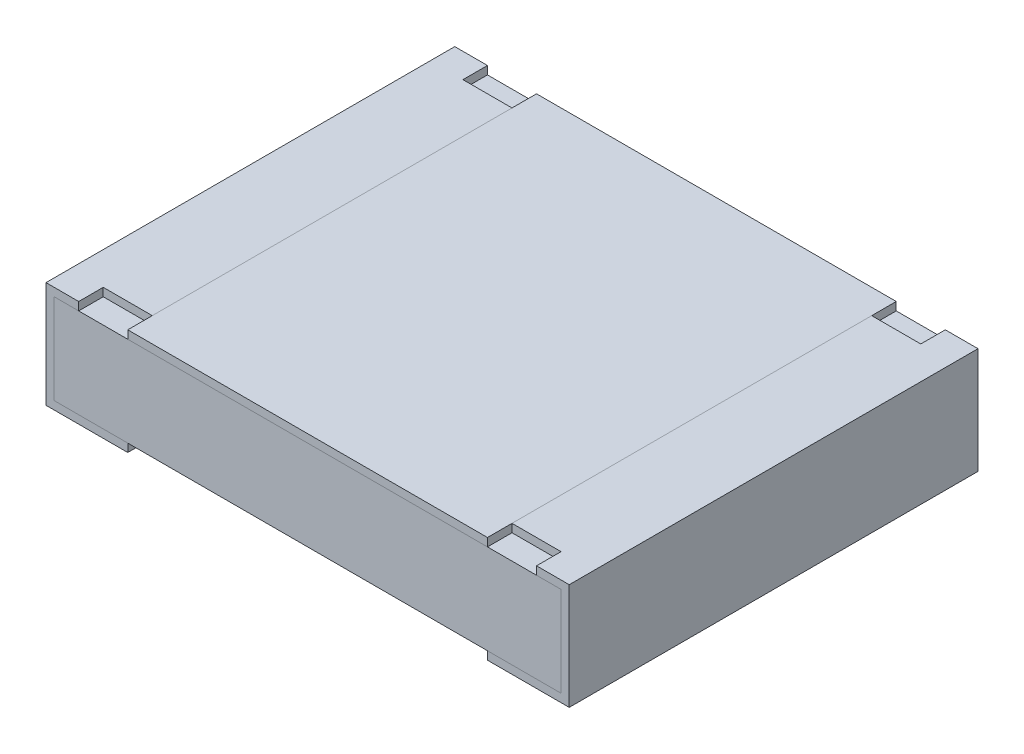
ISO-10303-21;
HEADER;
FILE_DESCRIPTION(('STEP AP214'),'2;1');
FILE_NAME('part.step','',(''),(''),'','','');
FILE_SCHEMA(('AUTOMOTIVE_DESIGN { 1 0 10303 214 1 1 1 1 }'));
ENDSEC;
DATA;
#1=APPLICATION_CONTEXT('core data for automotive mechanical design processes');
#2=APPLICATION_PROTOCOL_DEFINITION('international standard','automotive_design',2000,#1);
#3=PRODUCT_CONTEXT('',#1,'mechanical');
#4=PRODUCT('Part','Part','',(#3));
#5=PRODUCT_RELATED_PRODUCT_CATEGORY('part','',(#4));
#6=PRODUCT_DEFINITION_FORMATION('','',#4);
#7=PRODUCT_DEFINITION_CONTEXT('part definition',#1,'design');
#8=PRODUCT_DEFINITION('design','',#6,#7);
#9=PRODUCT_DEFINITION_SHAPE('','',#8);
#10=(LENGTH_UNIT() NAMED_UNIT(*) SI_UNIT(.MILLI.,.METRE.));
#11=(NAMED_UNIT(*) PLANE_ANGLE_UNIT() SI_UNIT($,.RADIAN.));
#12=(NAMED_UNIT(*) SI_UNIT($,.STERADIAN.) SOLID_ANGLE_UNIT());
#13=UNCERTAINTY_MEASURE_WITH_UNIT(LENGTH_MEASURE(1.E-05),#10,'distance_accuracy_value','');
#14=(GEOMETRIC_REPRESENTATION_CONTEXT(3) GLOBAL_UNCERTAINTY_ASSIGNED_CONTEXT((#13)) GLOBAL_UNIT_ASSIGNED_CONTEXT((#10,
#11,#12)) REPRESENTATION_CONTEXT('',''));
#15=CARTESIAN_POINT('',(0.,0.,0.));
#16=DIRECTION('',(0.,0.,1.));
#17=DIRECTION('',(1.,0.,0.));
#18=AXIS2_PLACEMENT_3D('',#15,#16,#17);
#19=CARTESIAN_POINT('',(-1.55,0.05,-1.25));
#20=DIRECTION('',(0.,1.,0.));
#21=DIRECTION('',(0.,0.,1.));
#22=AXIS2_PLACEMENT_3D('',#19,#20,#21);
#23=PLANE('',#22);
#24=DIRECTION('',(0.,0.,-1.));
#25=VECTOR('',#24,1.);
#26=CARTESIAN_POINT('',(-1.55,0.05,-1.25));
#27=LINE('',#26,#25);
#28=CARTESIAN_POINT('',(-1.55,0.05,1.25));
#29=VERTEX_POINT('',#28);
#30=CARTESIAN_POINT('',(-1.55,0.05,-1.25));
#31=VERTEX_POINT('',#30);
#32=EDGE_CURVE('P0_E58',#29,#31,#27,.T.);
#33=ORIENTED_EDGE('',*,*,#32,.T.);
#34=DIRECTION('',(1.,0.,0.));
#35=VECTOR('',#34,1.);
#36=CARTESIAN_POINT('',(1.55,0.05,-1.25));
#37=LINE('',#36,#35);
#38=CARTESIAN_POINT('',(1.55,0.05,-1.25));
#39=VERTEX_POINT('',#38);
#40=EDGE_CURVE('P0_E20',#31,#39,#37,.T.);
#41=ORIENTED_EDGE('',*,*,#40,.T.);
#42=DIRECTION('',(0.,0.,1.));
#43=VECTOR('',#42,1.);
#44=CARTESIAN_POINT('',(1.55,0.05,-1.25));
#45=LINE('',#44,#43);
#46=CARTESIAN_POINT('',(1.55,0.05,1.25));
#47=VERTEX_POINT('',#46);
#48=EDGE_CURVE('P0_E55',#39,#47,#45,.T.);
#49=ORIENTED_EDGE('',*,*,#48,.T.);
#50=DIRECTION('',(-1.,0.,0.));
#51=VECTOR('',#50,1.);
#52=CARTESIAN_POINT('',(1.55,0.05,1.25));
#53=LINE('',#52,#51);
#54=EDGE_CURVE('P0_E76',#47,#29,#53,.T.);
#55=ORIENTED_EDGE('',*,*,#54,.T.);
#56=EDGE_LOOP('',(#33,#41,#49,#55));
#57=FACE_BOUND('',#56,.T.);
#58=ADVANCED_FACE('P0_F17',(#57),#23,.F.);
#59=CARTESIAN_POINT('',(1.55,0.6,-1.25));
#60=DIRECTION('',(0.,0.,1.));
#61=DIRECTION('',(1.,0.,0.));
#62=AXIS2_PLACEMENT_3D('',#59,#60,#61);
#63=PLANE('',#62);
#64=ORIENTED_EDGE('',*,*,#40,.F.);
#65=DIRECTION('',(0.,1.,0.));
#66=VECTOR('',#65,1.);
#67=CARTESIAN_POINT('',(-1.55,0.6,-1.25));
#68=LINE('',#67,#66);
#69=CARTESIAN_POINT('',(-1.55,0.6,-1.25));
#70=VERTEX_POINT('',#69);
#71=EDGE_CURVE('P0_E80',#31,#70,#68,.T.);
#72=ORIENTED_EDGE('',*,*,#71,.T.);
#73=DIRECTION('',(1.,0.,0.));
#74=VECTOR('',#73,1.);
#75=CARTESIAN_POINT('',(-1.55,0.6,-1.25));
#76=LINE('',#75,#74);
#77=CARTESIAN_POINT('',(1.55,0.6,-1.25));
#78=VERTEX_POINT('',#77);
#79=EDGE_CURVE('P0_E73',#70,#78,#76,.T.);
#80=ORIENTED_EDGE('',*,*,#79,.T.);
#81=DIRECTION('',(0.,1.,0.));
#82=VECTOR('',#81,1.);
#83=CARTESIAN_POINT('',(1.55,0.6,-1.25));
#84=LINE('',#83,#82);
#85=EDGE_CURVE('P0_E63',#78,#39,#84,.F.);
#86=ORIENTED_EDGE('',*,*,#85,.T.);
#87=EDGE_LOOP('',(#64,#72,#80,#86));
#88=FACE_BOUND('',#87,.T.);
#89=ADVANCED_FACE('P0_F72',(#88),#63,.F.);
#90=CARTESIAN_POINT('',(1.55,0.6,-1.25));
#91=DIRECTION('',(-1.,0.,0.));
#92=DIRECTION('',(0.,0.,1.));
#93=AXIS2_PLACEMENT_3D('',#90,#91,#92);
#94=PLANE('',#93);
#95=ORIENTED_EDGE('',*,*,#48,.F.);
#96=ORIENTED_EDGE('',*,*,#85,.F.);
#97=DIRECTION('',(0.,0.,-1.));
#98=VECTOR('',#97,1.);
#99=CARTESIAN_POINT('',(1.55,0.6,1.25));
#100=LINE('',#99,#98);
#101=CARTESIAN_POINT('',(1.55,0.6,1.25));
#102=VERTEX_POINT('',#101);
#103=EDGE_CURVE('P0_E83',#78,#102,#100,.F.);
#104=ORIENTED_EDGE('',*,*,#103,.T.);
#105=DIRECTION('',(0.,1.,0.));
#106=VECTOR('',#105,1.);
#107=CARTESIAN_POINT('',(1.55,0.6,1.25));
#108=LINE('',#107,#106);
#109=EDGE_CURVE('P0_E69',#102,#47,#108,.F.);
#110=ORIENTED_EDGE('',*,*,#109,.T.);
#111=EDGE_LOOP('',(#95,#96,#104,#110));
#112=FACE_BOUND('',#111,.T.);
#113=ADVANCED_FACE('P0_F66',(#112),#94,.F.);
#114=CARTESIAN_POINT('',(1.55,0.6,1.25));
#115=DIRECTION('',(0.,0.,-1.));
#116=DIRECTION('',(-1.,0.,0.));
#117=AXIS2_PLACEMENT_3D('',#114,#115,#116);
#118=PLANE('',#117);
#119=ORIENTED_EDGE('',*,*,#54,.F.);
#120=ORIENTED_EDGE('',*,*,#109,.F.);
#121=DIRECTION('',(1.,0.,0.));
#122=VECTOR('',#121,1.);
#123=CARTESIAN_POINT('',(-1.55,0.6,1.25));
#124=LINE('',#123,#122);
#125=CARTESIAN_POINT('',(-1.55,0.6,1.25));
#126=VERTEX_POINT('',#125);
#127=EDGE_CURVE('P0_E26',#102,#126,#124,.F.);
#128=ORIENTED_EDGE('',*,*,#127,.T.);
#129=DIRECTION('',(0.,1.,0.));
#130=VECTOR('',#129,1.);
#131=CARTESIAN_POINT('',(-1.55,0.6,1.25));
#132=LINE('',#131,#130);
#133=EDGE_CURVE('P0_E34',#126,#29,#132,.F.);
#134=ORIENTED_EDGE('',*,*,#133,.T.);
#135=EDGE_LOOP('',(#119,#120,#128,#134));
#136=FACE_BOUND('',#135,.T.);
#137=ADVANCED_FACE('P0_F88',(#136),#118,.F.);
#138=CARTESIAN_POINT('',(-1.55,0.6,-1.25));
#139=DIRECTION('',(1.,0.,0.));
#140=DIRECTION('',(0.,0.,-1.));
#141=AXIS2_PLACEMENT_3D('',#138,#139,#140);
#142=PLANE('',#141);
#143=ORIENTED_EDGE('',*,*,#32,.F.);
#144=ORIENTED_EDGE('',*,*,#133,.F.);
#145=DIRECTION('',(0.,0.,-1.));
#146=VECTOR('',#145,1.);
#147=CARTESIAN_POINT('',(-1.55,0.6,1.25));
#148=LINE('',#147,#146);
#149=EDGE_CURVE('P0_E11',#126,#70,#148,.T.);
#150=ORIENTED_EDGE('',*,*,#149,.T.);
#151=ORIENTED_EDGE('',*,*,#71,.F.);
#152=EDGE_LOOP('',(#143,#144,#150,#151));
#153=FACE_BOUND('',#152,.T.);
#154=ADVANCED_FACE('P0_F91',(#153),#142,.F.);
#155=CARTESIAN_POINT('',(-1.55,0.6,1.25));
#156=DIRECTION('',(0.,-1.,0.));
#157=DIRECTION('',(0.,0.,-1.));
#158=AXIS2_PLACEMENT_3D('',#155,#156,#157);
#159=PLANE('',#158);
#160=ORIENTED_EDGE('',*,*,#127,.F.);
#161=ORIENTED_EDGE('',*,*,#103,.F.);
#162=ORIENTED_EDGE('',*,*,#79,.F.);
#163=ORIENTED_EDGE('',*,*,#149,.F.);
#164=EDGE_LOOP('',(#160,#161,#162,#163));
#165=FACE_BOUND('',#164,.T.);
#166=ADVANCED_FACE('P0_F90',(#165),#159,.F.);
#167=CLOSED_SHELL('',(#58,#89,#113,#137,#154,#166));
#168=MANIFOLD_SOLID_BREP('P0_B1',#167);
#169=CARTESIAN_POINT('',(3.60049995001,0.65,1.25));
#170=DIRECTION('',(0.,-1.,0.));
#171=DIRECTION('',(1.,0.,0.));
#172=AXIS2_PLACEMENT_3D('',#169,#170,#171);
#173=PLANE('',#172);
#174=DIRECTION('',(1.,0.,0.));
#175=VECTOR('',#174,1.);
#176=CARTESIAN_POINT('',(3.60049995001,0.65,-1.25));
#177=LINE('',#176,#175);
#178=CARTESIAN_POINT('',(1.1,0.65,-1.25));
#179=VERTEX_POINT('',#178);
#180=CARTESIAN_POINT('',(-1.1,0.65,-1.25));
#181=VERTEX_POINT('',#180);
#182=EDGE_CURVE('P1_E20',#179,#181,#177,.F.);
#183=ORIENTED_EDGE('',*,*,#182,.T.);
#184=DIRECTION('',(0.,0.,-1.));
#185=VECTOR('',#184,1.);
#186=CARTESIAN_POINT('',(-1.1,0.65,1.25));
#187=LINE('',#186,#185);
#188=CARTESIAN_POINT('',(-1.1,0.65,1.25));
#189=VERTEX_POINT('',#188);
#190=EDGE_CURVE('P1_E55',#181,#189,#187,.F.);
#191=ORIENTED_EDGE('',*,*,#190,.T.);
#192=DIRECTION('',(-1.,0.,0.));
#193=VECTOR('',#192,1.);
#194=CARTESIAN_POINT('',(3.60049995001,0.65,1.25));
#195=LINE('',#194,#193);
#196=CARTESIAN_POINT('',(1.1,0.65,1.25));
#197=VERTEX_POINT('',#196);
#198=EDGE_CURVE('P1_E76',#189,#197,#195,.F.);
#199=ORIENTED_EDGE('',*,*,#198,.T.);
#200=DIRECTION('',(0.,0.,-1.));
#201=VECTOR('',#200,1.);
#202=CARTESIAN_POINT('',(1.1,0.65,1.25));
#203=LINE('',#202,#201);
#204=EDGE_CURVE('P1_E58',#179,#197,#203,.F.);
#205=ORIENTED_EDGE('',*,*,#204,.F.);
#206=EDGE_LOOP('',(#183,#191,#199,#205));
#207=FACE_BOUND('',#206,.T.);
#208=ADVANCED_FACE('P1_F17',(#207),#173,.F.);
#209=CARTESIAN_POINT('',(3.60049995001,0.65,-1.25));
#210=DIRECTION('',(0.,0.,1.));
#211=DIRECTION('',(1.,0.,0.));
#212=AXIS2_PLACEMENT_3D('',#209,#210,#211);
#213=PLANE('',#212);
#214=DIRECTION('',(-1.,0.,0.));
#215=VECTOR('',#214,1.);
#216=CARTESIAN_POINT('',(3.60049995001,0.6,-1.25));
#217=LINE('',#216,#215);
#218=CARTESIAN_POINT('',(1.1,0.6,-1.25));
#219=VERTEX_POINT('',#218);
#220=CARTESIAN_POINT('',(-1.1,0.6,-1.25));
#221=VERTEX_POINT('',#220);
#222=EDGE_CURVE('P1_E73',#219,#221,#217,.T.);
#223=ORIENTED_EDGE('',*,*,#222,.T.);
#224=DIRECTION('',(0.,1.,0.));
#225=VECTOR('',#224,1.);
#226=CARTESIAN_POINT('',(-1.1,0.6,-1.25));
#227=LINE('',#226,#225);
#228=EDGE_CURVE('P1_E63',#221,#181,#227,.T.);
#229=ORIENTED_EDGE('',*,*,#228,.T.);
#230=ORIENTED_EDGE('',*,*,#182,.F.);
#231=DIRECTION('',(0.,1.,0.));
#232=VECTOR('',#231,1.);
#233=CARTESIAN_POINT('',(1.1,0.65,-1.25));
#234=LINE('',#233,#232);
#235=EDGE_CURVE('P1_E80',#219,#179,#234,.T.);
#236=ORIENTED_EDGE('',*,*,#235,.F.);
#237=EDGE_LOOP('',(#223,#229,#230,#236));
#238=FACE_BOUND('',#237,.T.);
#239=ADVANCED_FACE('P1_F72',(#238),#213,.F.);
#240=CARTESIAN_POINT('',(-1.1,0.6,1.25));
#241=DIRECTION('',(1.,0.,0.));
#242=DIRECTION('',(0.,0.,-1.));
#243=AXIS2_PLACEMENT_3D('',#240,#241,#242);
#244=PLANE('',#243);
#245=ORIENTED_EDGE('',*,*,#190,.F.);
#246=ORIENTED_EDGE('',*,*,#228,.F.);
#247=DIRECTION('',(0.,0.,1.));
#248=VECTOR('',#247,1.);
#249=CARTESIAN_POINT('',(-1.1,0.6,1.25));
#250=LINE('',#249,#248);
#251=CARTESIAN_POINT('',(-1.1,0.6,1.25));
#252=VERTEX_POINT('',#251);
#253=EDGE_CURVE('P1_E83',#221,#252,#250,.T.);
#254=ORIENTED_EDGE('',*,*,#253,.T.);
#255=DIRECTION('',(0.,1.,0.));
#256=VECTOR('',#255,1.);
#257=CARTESIAN_POINT('',(-1.1,0.65,1.25));
#258=LINE('',#257,#256);
#259=EDGE_CURVE('P1_E69',#252,#189,#258,.T.);
#260=ORIENTED_EDGE('',*,*,#259,.T.);
#261=EDGE_LOOP('',(#245,#246,#254,#260));
#262=FACE_BOUND('',#261,.T.);
#263=ADVANCED_FACE('P1_F66',(#262),#244,.F.);
#264=CARTESIAN_POINT('',(3.60049995001,0.65,1.25));
#265=DIRECTION('',(0.,0.,-1.));
#266=DIRECTION('',(-1.,0.,0.));
#267=AXIS2_PLACEMENT_3D('',#264,#265,#266);
#268=PLANE('',#267);
#269=ORIENTED_EDGE('',*,*,#198,.F.);
#270=ORIENTED_EDGE('',*,*,#259,.F.);
#271=DIRECTION('',(-1.,0.,0.));
#272=VECTOR('',#271,1.);
#273=CARTESIAN_POINT('',(3.60049995001,0.6,1.25));
#274=LINE('',#273,#272);
#275=CARTESIAN_POINT('',(1.1,0.6,1.25));
#276=VERTEX_POINT('',#275);
#277=EDGE_CURVE('P1_E26',#252,#276,#274,.F.);
#278=ORIENTED_EDGE('',*,*,#277,.T.);
#279=DIRECTION('',(0.,1.,0.));
#280=VECTOR('',#279,1.);
#281=CARTESIAN_POINT('',(1.1,0.65,1.25));
#282=LINE('',#281,#280);
#283=EDGE_CURVE('P1_E34',#197,#276,#282,.F.);
#284=ORIENTED_EDGE('',*,*,#283,.F.);
#285=EDGE_LOOP('',(#269,#270,#278,#284));
#286=FACE_BOUND('',#285,.T.);
#287=ADVANCED_FACE('P1_F88',(#286),#268,.F.);
#288=CARTESIAN_POINT('',(1.1,0.65,1.25));
#289=DIRECTION('',(1.,0.,0.));
#290=DIRECTION('',(0.,0.,-1.));
#291=AXIS2_PLACEMENT_3D('',#288,#289,#290);
#292=PLANE('',#291);
#293=DIRECTION('',(0.,0.,1.));
#294=VECTOR('',#293,1.);
#295=CARTESIAN_POINT('',(1.1,0.6,1.25));
#296=LINE('',#295,#294);
#297=EDGE_CURVE('P1_E11',#276,#219,#296,.F.);
#298=ORIENTED_EDGE('',*,*,#297,.T.);
#299=ORIENTED_EDGE('',*,*,#235,.T.);
#300=ORIENTED_EDGE('',*,*,#204,.T.);
#301=ORIENTED_EDGE('',*,*,#283,.T.);
#302=EDGE_LOOP('',(#298,#299,#300,#301));
#303=FACE_BOUND('',#302,.T.);
#304=ADVANCED_FACE('P1_F91',(#303),#292,.T.);
#305=CARTESIAN_POINT('',(3.60049995001,0.6,1.25));
#306=DIRECTION('',(0.,1.,0.));
#307=DIRECTION('',(-1.,0.,0.));
#308=AXIS2_PLACEMENT_3D('',#305,#306,#307);
#309=PLANE('',#308);
#310=ORIENTED_EDGE('',*,*,#277,.F.);
#311=ORIENTED_EDGE('',*,*,#253,.F.);
#312=ORIENTED_EDGE('',*,*,#222,.F.);
#313=ORIENTED_EDGE('',*,*,#297,.F.);
#314=EDGE_LOOP('',(#310,#311,#312,#313));
#315=FACE_BOUND('',#314,.T.);
#316=ADVANCED_FACE('P1_F90',(#315),#309,.F.);
#317=CLOSED_SHELL('',(#208,#239,#263,#287,#304,#316));
#318=MANIFOLD_SOLID_BREP('P1_B1',#317);
#319=CARTESIAN_POINT('',(-1.55,0.6,-1.25));
#320=DIRECTION('',(1.,0.,0.));
#321=DIRECTION('',(0.,0.,-1.));
#322=AXIS2_PLACEMENT_3D('',#319,#320,#321);
#323=PLANE('',#322);
#324=DIRECTION('',(0.,1.,0.));
#325=VECTOR('',#324,1.);
#326=CARTESIAN_POINT('',(-1.55,0.6,-1.25));
#327=LINE('',#326,#325);
#328=CARTESIAN_POINT('',(-1.55,0.05,-1.25));
#329=VERTEX_POINT('',#328);
#330=CARTESIAN_POINT('',(-1.55,0.6,-1.25));
#331=VERTEX_POINT('',#330);
#332=EDGE_CURVE('P2_E102',#329,#331,#327,.T.);
#333=ORIENTED_EDGE('',*,*,#332,.T.);
#334=DIRECTION('',(0.,0.,1.));
#335=VECTOR('',#334,1.);
#336=CARTESIAN_POINT('',(-1.55,0.6,-1.25));
#337=LINE('',#336,#335);
#338=CARTESIAN_POINT('',(-1.55,0.6,1.25));
#339=VERTEX_POINT('',#338);
#340=EDGE_CURVE('P2_E121',#331,#339,#337,.T.);
#341=ORIENTED_EDGE('',*,*,#340,.T.);
#342=DIRECTION('',(0.,1.,0.));
#343=VECTOR('',#342,1.);
#344=CARTESIAN_POINT('',(-1.55,0.6,1.25));
#345=LINE('',#344,#343);
#346=CARTESIAN_POINT('',(-1.55,0.05,1.25));
#347=VERTEX_POINT('',#346);
#348=EDGE_CURVE('P2_E20',#339,#347,#345,.F.);
#349=ORIENTED_EDGE('',*,*,#348,.T.);
#350=DIRECTION('',(0.,0.,-1.));
#351=VECTOR('',#350,1.);
#352=CARTESIAN_POINT('',(-1.55,0.05,-1.25));
#353=LINE('',#352,#351);
#354=EDGE_CURVE('P2_E116',#347,#329,#353,.T.);
#355=ORIENTED_EDGE('',*,*,#354,.T.);
#356=EDGE_LOOP('',(#333,#341,#349,#355));
#357=FACE_BOUND('',#356,.T.);
#358=ADVANCED_FACE('P2_F17',(#357),#323,.T.);
#359=CARTESIAN_POINT('',(-1.55,0.05,-1.25));
#360=DIRECTION('',(0.,-1.,0.));
#361=DIRECTION('',(0.,0.,-1.));
#362=AXIS2_PLACEMENT_3D('',#359,#360,#361);
#363=PLANE('',#362);
#364=DIRECTION('',(1.,0.,0.));
#365=VECTOR('',#364,1.);
#366=CARTESIAN_POINT('',(-1.55,0.05,-1.25));
#367=LINE('',#366,#365);
#368=CARTESIAN_POINT('',(-1.1,0.05,-1.25));
#369=VERTEX_POINT('',#368);
#370=EDGE_CURVE('P2_E124',#329,#369,#367,.T.);
#371=ORIENTED_EDGE('',*,*,#370,.F.);
#372=ORIENTED_EDGE('',*,*,#354,.F.);
#373=DIRECTION('',(1.,0.,0.));
#374=VECTOR('',#373,1.);
#375=CARTESIAN_POINT('',(-1.55,0.05,1.25));
#376=LINE('',#375,#374);
#377=CARTESIAN_POINT('',(-1.1,0.05,1.25));
#378=VERTEX_POINT('',#377);
#379=EDGE_CURVE('P2_E106',#378,#347,#376,.F.);
#380=ORIENTED_EDGE('',*,*,#379,.F.);
#381=DIRECTION('',(0.,0.,-1.));
#382=VECTOR('',#381,1.);
#383=CARTESIAN_POINT('',(-1.1,0.05,0.));
#384=LINE('',#383,#382);
#385=EDGE_CURVE('P2_E143',#369,#378,#384,.F.);
#386=ORIENTED_EDGE('',*,*,#385,.F.);
#387=EDGE_LOOP('',(#371,#372,#380,#386));
#388=FACE_BOUND('',#387,.T.);
#389=ADVANCED_FACE('P2_F123',(#388),#363,.F.);
#390=CARTESIAN_POINT('',(-4.07549995001,0.6,-1.25));
#391=DIRECTION('',(0.,1.,0.));
#392=DIRECTION('',(0.,0.,1.));
#393=AXIS2_PLACEMENT_3D('',#390,#391,#392);
#394=PLANE('',#393);
#395=DIRECTION('',(1.,0.,0.));
#396=VECTOR('',#395,1.);
#397=CARTESIAN_POINT('',(-4.07549995001,0.6,1.1));
#398=LINE('',#397,#396);
#399=CARTESIAN_POINT('',(-1.4,0.6,1.1));
#400=VERTEX_POINT('',#399);
#401=CARTESIAN_POINT('',(-1.1,0.6,1.1));
#402=VERTEX_POINT('',#401);
#403=EDGE_CURVE('P2_E140',#400,#402,#398,.T.);
#404=ORIENTED_EDGE('',*,*,#403,.F.);
#405=DIRECTION('',(0.,0.,1.));
#406=VECTOR('',#405,1.);
#407=CARTESIAN_POINT('',(-1.4,0.6,-1.25));
#408=LINE('',#407,#406);
#409=CARTESIAN_POINT('',(-1.4,0.6,1.25));
#410=VERTEX_POINT('',#409);
#411=EDGE_CURVE('P2_E136',#410,#400,#408,.F.);
#412=ORIENTED_EDGE('',*,*,#411,.F.);
#413=DIRECTION('',(1.,0.,0.));
#414=VECTOR('',#413,1.);
#415=CARTESIAN_POINT('',(-4.07549995001,0.6,1.25));
#416=LINE('',#415,#414);
#417=EDGE_CURVE('P2_E134',#339,#410,#416,.T.);
#418=ORIENTED_EDGE('',*,*,#417,.F.);
#419=ORIENTED_EDGE('',*,*,#340,.F.);
#420=DIRECTION('',(1.,0.,0.));
#421=VECTOR('',#420,1.);
#422=CARTESIAN_POINT('',(-4.07549995001,0.6,-1.25));
#423=LINE('',#422,#421);
#424=CARTESIAN_POINT('',(-1.4,0.6,-1.25));
#425=VERTEX_POINT('',#424);
#426=EDGE_CURVE('P2_E126',#425,#331,#423,.F.);
#427=ORIENTED_EDGE('',*,*,#426,.F.);
#428=DIRECTION('',(0.,0.,1.));
#429=VECTOR('',#428,1.);
#430=CARTESIAN_POINT('',(-1.4,0.6,-1.25));
#431=LINE('',#430,#429);
#432=CARTESIAN_POINT('',(-1.4,0.6,-1.1));
#433=VERTEX_POINT('',#432);
#434=EDGE_CURVE('P2_E145',#425,#433,#431,.T.);
#435=ORIENTED_EDGE('',*,*,#434,.T.);
#436=DIRECTION('',(1.,0.,0.));
#437=VECTOR('',#436,1.);
#438=CARTESIAN_POINT('',(-1.1,0.6,-1.1));
#439=LINE('',#438,#437);
#440=CARTESIAN_POINT('',(-1.1,0.6,-1.1));
#441=VERTEX_POINT('',#440);
#442=EDGE_CURVE('P2_E150',#433,#441,#439,.T.);
#443=ORIENTED_EDGE('',*,*,#442,.T.);
#444=DIRECTION('',(0.,0.,1.));
#445=VECTOR('',#444,1.);
#446=CARTESIAN_POINT('',(-1.1,0.6,1.25));
#447=LINE('',#446,#445);
#448=EDGE_CURVE('P2_E155',#441,#402,#447,.T.);
#449=ORIENTED_EDGE('',*,*,#448,.T.);
#450=EDGE_LOOP('',(#404,#412,#418,#419,#427,#435,#443,#449));
#451=FACE_BOUND('',#450,.T.);
#452=ADVANCED_FACE('P2_F131',(#451),#394,.F.);
#453=CARTESIAN_POINT('',(-1.1,0.025,0.));
#454=DIRECTION('',(1.,0.,0.));
#455=DIRECTION('',(0.,0.,-1.));
#456=AXIS2_PLACEMENT_3D('',#453,#454,#455);
#457=PLANE('',#456);
#458=DIRECTION('',(0.,-1.,0.));
#459=VECTOR('',#458,1.);
#460=CARTESIAN_POINT('',(-1.1,0.65,-1.25));
#461=LINE('',#460,#459);
#462=CARTESIAN_POINT('',(-1.1,0.,-1.25));
#463=VERTEX_POINT('',#462);
#464=EDGE_CURVE('P2_E164',#463,#369,#461,.F.);
#465=ORIENTED_EDGE('',*,*,#464,.T.);
#466=ORIENTED_EDGE('',*,*,#385,.T.);
#467=DIRECTION('',(0.,1.,0.));
#468=VECTOR('',#467,1.);
#469=CARTESIAN_POINT('',(-1.1,0.025,1.25));
#470=LINE('',#469,#468);
#471=CARTESIAN_POINT('',(-1.1,0.,1.25));
#472=VERTEX_POINT('',#471);
#473=EDGE_CURVE('P2_E111',#378,#472,#470,.F.);
#474=ORIENTED_EDGE('',*,*,#473,.T.);
#475=DIRECTION('',(0.,0.,1.));
#476=VECTOR('',#475,1.);
#477=CARTESIAN_POINT('',(-1.1,0.,1.25));
#478=LINE('',#477,#476);
#479=EDGE_CURVE('P2_E171',#472,#463,#478,.F.);
#480=ORIENTED_EDGE('',*,*,#479,.T.);
#481=EDGE_LOOP('',(#465,#466,#474,#480));
#482=FACE_BOUND('',#481,.T.);
#483=ADVANCED_FACE('P2_F209',(#482),#457,.T.);
#484=CARTESIAN_POINT('',(-1.4,-0.001,-1.25));
#485=DIRECTION('',(-1.,0.,0.));
#486=DIRECTION('',(0.,0.,1.));
#487=AXIS2_PLACEMENT_3D('',#484,#485,#486);
#488=PLANE('',#487);
#489=DIRECTION('',(0.,-1.,0.));
#490=VECTOR('',#489,1.);
#491=CARTESIAN_POINT('',(-1.4,0.65,-1.25));
#492=LINE('',#491,#490);
#493=CARTESIAN_POINT('',(-1.4,0.65,-1.25));
#494=VERTEX_POINT('',#493);
#495=EDGE_CURVE('P2_E167',#425,#494,#492,.F.);
#496=ORIENTED_EDGE('',*,*,#495,.T.);
#497=DIRECTION('',(0.,0.,-1.));
#498=VECTOR('',#497,1.);
#499=CARTESIAN_POINT('',(-1.4,0.65,1.25));
#500=LINE('',#499,#498);
#501=CARTESIAN_POINT('',(-1.4,0.65,-1.1));
#502=VERTEX_POINT('',#501);
#503=EDGE_CURVE('P2_E183',#494,#502,#500,.F.);
#504=ORIENTED_EDGE('',*,*,#503,.T.);
#505=DIRECTION('',(0.,-1.,0.));
#506=VECTOR('',#505,1.);
#507=CARTESIAN_POINT('',(-1.4,-0.001,-1.1));
#508=LINE('',#507,#506);
#509=EDGE_CURVE('P2_E147',#502,#433,#508,.T.);
#510=ORIENTED_EDGE('',*,*,#509,.T.);
#511=ORIENTED_EDGE('',*,*,#434,.F.);
#512=EDGE_LOOP('',(#496,#504,#510,#511));
#513=FACE_BOUND('',#512,.T.);
#514=ADVANCED_FACE('P2_F221',(#513),#488,.F.);
#515=CARTESIAN_POINT('',(-1.1,-0.001,-1.1));
#516=DIRECTION('',(0.,0.,1.));
#517=DIRECTION('',(0.,-1.,0.));
#518=AXIS2_PLACEMENT_3D('',#515,#516,#517);
#519=PLANE('',#518);
#520=ORIENTED_EDGE('',*,*,#509,.F.);
#521=DIRECTION('',(1.,0.,0.));
#522=VECTOR('',#521,1.);
#523=CARTESIAN_POINT('',(-4.07549995001,0.65,-1.1));
#524=LINE('',#523,#522);
#525=CARTESIAN_POINT('',(-1.1,0.65,-1.1));
#526=VERTEX_POINT('',#525);
#527=EDGE_CURVE('P2_E185',#502,#526,#524,.T.);
#528=ORIENTED_EDGE('',*,*,#527,.T.);
#529=DIRECTION('',(0.,1.,0.));
#530=VECTOR('',#529,1.);
#531=CARTESIAN_POINT('',(-1.1,0.65,-1.1));
#532=LINE('',#531,#530);
#533=EDGE_CURVE('P2_E152',#526,#441,#532,.F.);
#534=ORIENTED_EDGE('',*,*,#533,.T.);
#535=ORIENTED_EDGE('',*,*,#442,.F.);
#536=EDGE_LOOP('',(#520,#528,#534,#535));
#537=FACE_BOUND('',#536,.T.);
#538=ADVANCED_FACE('P2_F224',(#537),#519,.F.);
#539=CARTESIAN_POINT('',(-1.1,0.65,1.25));
#540=DIRECTION('',(-1.,0.,0.));
#541=DIRECTION('',(0.,0.,1.));
#542=AXIS2_PLACEMENT_3D('',#539,#540,#541);
#543=PLANE('',#542);
#544=DIRECTION('',(0.,1.,0.));
#545=VECTOR('',#544,1.);
#546=CARTESIAN_POINT('',(-1.1,-0.001,1.1));
#547=LINE('',#546,#545);
#548=CARTESIAN_POINT('',(-1.1,0.65,1.1));
#549=VERTEX_POINT('',#548);
#550=EDGE_CURVE('P2_E158',#549,#402,#547,.F.);
#551=ORIENTED_EDGE('',*,*,#550,.T.);
#552=ORIENTED_EDGE('',*,*,#448,.F.);
#553=ORIENTED_EDGE('',*,*,#533,.F.);
#554=DIRECTION('',(0.,0.,-1.));
#555=VECTOR('',#554,1.);
#556=CARTESIAN_POINT('',(-1.1,0.65,1.25));
#557=LINE('',#556,#555);
#558=EDGE_CURVE('P2_E187',#526,#549,#557,.F.);
#559=ORIENTED_EDGE('',*,*,#558,.T.);
#560=EDGE_LOOP('',(#551,#552,#553,#559));
#561=FACE_BOUND('',#560,.T.);
#562=ADVANCED_FACE('P2_F229',(#561),#543,.F.);
#563=CARTESIAN_POINT('',(-1.1,-0.001,1.1));
#564=DIRECTION('',(0.,0.,-1.));
#565=DIRECTION('',(0.,1.,0.));
#566=AXIS2_PLACEMENT_3D('',#563,#564,#565);
#567=PLANE('',#566);
#568=ORIENTED_EDGE('',*,*,#550,.F.);
#569=DIRECTION('',(1.,0.,0.));
#570=VECTOR('',#569,1.);
#571=CARTESIAN_POINT('',(-4.07549995001,0.65,1.1));
#572=LINE('',#571,#570);
#573=CARTESIAN_POINT('',(-1.4,0.65,1.1));
#574=VERTEX_POINT('',#573);
#575=EDGE_CURVE('P2_E189',#549,#574,#572,.F.);
#576=ORIENTED_EDGE('',*,*,#575,.T.);
#577=DIRECTION('',(0.,1.,0.));
#578=VECTOR('',#577,1.);
#579=CARTESIAN_POINT('',(-1.4,-0.001,1.1));
#580=LINE('',#579,#578);
#581=EDGE_CURVE('P2_E161',#574,#400,#580,.F.);
#582=ORIENTED_EDGE('',*,*,#581,.T.);
#583=ORIENTED_EDGE('',*,*,#403,.T.);
#584=EDGE_LOOP('',(#568,#576,#582,#583));
#585=FACE_BOUND('',#584,.T.);
#586=ADVANCED_FACE('P2_F231',(#585),#567,.F.);
#587=CARTESIAN_POINT('',(-1.4,-0.001,1.25));
#588=DIRECTION('',(-1.,0.,0.));
#589=DIRECTION('',(0.,0.,1.));
#590=AXIS2_PLACEMENT_3D('',#587,#588,#589);
#591=PLANE('',#590);
#592=ORIENTED_EDGE('',*,*,#581,.F.);
#593=DIRECTION('',(0.,0.,-1.));
#594=VECTOR('',#593,1.);
#595=CARTESIAN_POINT('',(-1.4,0.65,1.25));
#596=LINE('',#595,#594);
#597=CARTESIAN_POINT('',(-1.4,0.65,1.25));
#598=VERTEX_POINT('',#597);
#599=EDGE_CURVE('P2_E191',#574,#598,#596,.F.);
#600=ORIENTED_EDGE('',*,*,#599,.T.);
#601=DIRECTION('',(0.,1.,0.));
#602=VECTOR('',#601,1.);
#603=CARTESIAN_POINT('',(-1.4,0.6,1.25));
#604=LINE('',#603,#602);
#605=EDGE_CURVE('P2_E176',#598,#410,#604,.F.);
#606=ORIENTED_EDGE('',*,*,#605,.T.);
#607=ORIENTED_EDGE('',*,*,#411,.T.);
#608=EDGE_LOOP('',(#592,#600,#606,#607));
#609=FACE_BOUND('',#608,.T.);
#610=ADVANCED_FACE('P2_F235',(#609),#591,.F.);
#611=CARTESIAN_POINT('',(-4.07549995001,0.65,-1.25));
#612=DIRECTION('',(0.,0.,1.));
#613=DIRECTION('',(0.,-1.,0.));
#614=AXIS2_PLACEMENT_3D('',#611,#612,#613);
#615=PLANE('',#614);
#616=ORIENTED_EDGE('',*,*,#495,.F.);
#617=ORIENTED_EDGE('',*,*,#426,.T.);
#618=ORIENTED_EDGE('',*,*,#332,.F.);
#619=ORIENTED_EDGE('',*,*,#370,.T.);
#620=ORIENTED_EDGE('',*,*,#464,.F.);
#621=DIRECTION('',(1.,0.,0.));
#622=VECTOR('',#621,1.);
#623=CARTESIAN_POINT('',(-1.6,0.,-1.25));
#624=LINE('',#623,#622);
#625=CARTESIAN_POINT('',(-1.6,0.,-1.25));
#626=VERTEX_POINT('',#625);
#627=EDGE_CURVE('P2_E169',#463,#626,#624,.F.);
#628=ORIENTED_EDGE('',*,*,#627,.T.);
#629=DIRECTION('',(0.,1.,0.));
#630=VECTOR('',#629,1.);
#631=CARTESIAN_POINT('',(-1.6,0.65,-1.25));
#632=LINE('',#631,#630);
#633=CARTESIAN_POINT('',(-1.6,0.65,-1.25));
#634=VERTEX_POINT('',#633);
#635=EDGE_CURVE('P2_E194',#634,#626,#632,.F.);
#636=ORIENTED_EDGE('',*,*,#635,.F.);
#637=DIRECTION('',(1.,0.,0.));
#638=VECTOR('',#637,1.);
#639=CARTESIAN_POINT('',(-4.07549995001,0.65,-1.25));
#640=LINE('',#639,#638);
#641=EDGE_CURVE('P2_E180',#634,#494,#640,.T.);
#642=ORIENTED_EDGE('',*,*,#641,.T.);
#643=EDGE_LOOP('',(#616,#617,#618,#619,#620,#628,#636,#642));
#644=FACE_BOUND('',#643,.T.);
#645=ADVANCED_FACE('P2_F211',(#644),#615,.F.);
#646=CARTESIAN_POINT('',(-1.6,0.,1.25));
#647=DIRECTION('',(0.,1.,0.));
#648=DIRECTION('',(0.,0.,1.));
#649=AXIS2_PLACEMENT_3D('',#646,#647,#648);
#650=PLANE('',#649);
#651=DIRECTION('',(-1.,0.,0.));
#652=VECTOR('',#651,1.);
#653=CARTESIAN_POINT('',(-4.07549995001,0.,1.25));
#654=LINE('',#653,#652);
#655=CARTESIAN_POINT('',(-1.6,0.,1.25));
#656=VERTEX_POINT('',#655);
#657=EDGE_CURVE('P2_E174',#472,#656,#654,.T.);
#658=ORIENTED_EDGE('',*,*,#657,.T.);
#659=DIRECTION('',(0.,0.,1.));
#660=VECTOR('',#659,1.);
#661=CARTESIAN_POINT('',(-1.6,0.,1.25));
#662=LINE('',#661,#660);
#663=EDGE_CURVE('P2_E197',#626,#656,#662,.T.);
#664=ORIENTED_EDGE('',*,*,#663,.F.);
#665=ORIENTED_EDGE('',*,*,#627,.F.);
#666=ORIENTED_EDGE('',*,*,#479,.F.);
#667=EDGE_LOOP('',(#658,#664,#665,#666));
#668=FACE_BOUND('',#667,.T.);
#669=ADVANCED_FACE('P2_F206',(#668),#650,.F.);
#670=CARTESIAN_POINT('',(-4.07549995001,0.6,1.25));
#671=DIRECTION('',(0.,0.,-1.));
#672=DIRECTION('',(-1.,0.,0.));
#673=AXIS2_PLACEMENT_3D('',#670,#671,#672);
#674=PLANE('',#673);
#675=ORIENTED_EDGE('',*,*,#605,.F.);
#676=DIRECTION('',(1.,0.,0.));
#677=VECTOR('',#676,1.);
#678=CARTESIAN_POINT('',(-4.07549995001,0.65,1.25));
#679=LINE('',#678,#677);
#680=CARTESIAN_POINT('',(-1.6,0.65,1.25));
#681=VERTEX_POINT('',#680);
#682=EDGE_CURVE('P2_E35',#598,#681,#679,.F.);
#683=ORIENTED_EDGE('',*,*,#682,.T.);
#684=DIRECTION('',(0.,1.,0.));
#685=VECTOR('',#684,1.);
#686=CARTESIAN_POINT('',(-1.6,0.65,1.25));
#687=LINE('',#686,#685);
#688=EDGE_CURVE('P2_E26',#656,#681,#687,.T.);
#689=ORIENTED_EDGE('',*,*,#688,.F.);
#690=ORIENTED_EDGE('',*,*,#657,.F.);
#691=ORIENTED_EDGE('',*,*,#473,.F.);
#692=ORIENTED_EDGE('',*,*,#379,.T.);
#693=ORIENTED_EDGE('',*,*,#348,.F.);
#694=ORIENTED_EDGE('',*,*,#417,.T.);
#695=EDGE_LOOP('',(#675,#683,#689,#690,#691,#692,#693,#694));
#696=FACE_BOUND('',#695,.T.);
#697=ADVANCED_FACE('P2_F108',(#696),#674,.F.);
#698=CARTESIAN_POINT('',(-4.07549995001,0.65,1.25));
#699=DIRECTION('',(0.,-1.,0.));
#700=DIRECTION('',(0.,0.,-1.));
#701=AXIS2_PLACEMENT_3D('',#698,#699,#700);
#702=PLANE('',#701);
#703=ORIENTED_EDGE('',*,*,#575,.F.);
#704=ORIENTED_EDGE('',*,*,#558,.F.);
#705=ORIENTED_EDGE('',*,*,#527,.F.);
#706=ORIENTED_EDGE('',*,*,#503,.F.);
#707=ORIENTED_EDGE('',*,*,#641,.F.);
#708=DIRECTION('',(0.,0.,1.));
#709=VECTOR('',#708,1.);
#710=CARTESIAN_POINT('',(-1.6,0.65,1.25));
#711=LINE('',#710,#709);
#712=EDGE_CURVE('P2_E11',#681,#634,#711,.F.);
#713=ORIENTED_EDGE('',*,*,#712,.F.);
#714=ORIENTED_EDGE('',*,*,#682,.F.);
#715=ORIENTED_EDGE('',*,*,#599,.F.);
#716=EDGE_LOOP('',(#703,#704,#705,#706,#707,#713,#714,#715));
#717=FACE_BOUND('',#716,.T.);
#718=ADVANCED_FACE('P2_F216',(#717),#702,.F.);
#719=CARTESIAN_POINT('',(-1.6,0.65,1.25));
#720=DIRECTION('',(-1.,0.,0.));
#721=DIRECTION('',(0.,0.,1.));
#722=AXIS2_PLACEMENT_3D('',#719,#720,#721);
#723=PLANE('',#722);
#724=ORIENTED_EDGE('',*,*,#688,.T.);
#725=ORIENTED_EDGE('',*,*,#712,.T.);
#726=ORIENTED_EDGE('',*,*,#635,.T.);
#727=ORIENTED_EDGE('',*,*,#663,.T.);
#728=EDGE_LOOP('',(#724,#725,#726,#727));
#729=FACE_BOUND('',#728,.T.);
#730=ADVANCED_FACE('P2_F202',(#729),#723,.T.);
#731=CLOSED_SHELL('',(#358,#389,#452,#483,#514,#538,#562,#586,#610,#645,#669,#697,#718,#730));
#732=MANIFOLD_SOLID_BREP('P2_B1',#731);
#733=CARTESIAN_POINT('',(1.55,0.6,-1.25));
#734=DIRECTION('',(-1.,0.,0.));
#735=DIRECTION('',(0.,0.,1.));
#736=AXIS2_PLACEMENT_3D('',#733,#734,#735);
#737=PLANE('',#736);
#738=DIRECTION('',(0.,1.,0.));
#739=VECTOR('',#738,1.);
#740=CARTESIAN_POINT('',(1.55,0.6,-1.25));
#741=LINE('',#740,#739);
#742=CARTESIAN_POINT('',(1.55,0.6,-1.25));
#743=VERTEX_POINT('',#742);
#744=CARTESIAN_POINT('',(1.55,0.05,-1.25));
#745=VERTEX_POINT('',#744);
#746=EDGE_CURVE('P3_E115',#743,#745,#741,.F.);
#747=ORIENTED_EDGE('',*,*,#746,.T.);
#748=DIRECTION('',(0.,0.,-1.));
#749=VECTOR('',#748,1.);
#750=CARTESIAN_POINT('',(1.55,0.05,-1.25));
#751=LINE('',#750,#749);
#752=CARTESIAN_POINT('',(1.55,0.05,1.25));
#753=VERTEX_POINT('',#752);
#754=EDGE_CURVE('P3_E136',#745,#753,#751,.F.);
#755=ORIENTED_EDGE('',*,*,#754,.T.);
#756=DIRECTION('',(0.,1.,0.));
#757=VECTOR('',#756,1.);
#758=CARTESIAN_POINT('',(1.55,0.6,1.25));
#759=LINE('',#758,#757);
#760=CARTESIAN_POINT('',(1.55,0.6,1.25));
#761=VERTEX_POINT('',#760);
#762=EDGE_CURVE('P3_E20',#753,#761,#759,.T.);
#763=ORIENTED_EDGE('',*,*,#762,.T.);
#764=DIRECTION('',(0.,0.,1.));
#765=VECTOR('',#764,1.);
#766=CARTESIAN_POINT('',(1.55,0.6,-1.25));
#767=LINE('',#766,#765);
#768=EDGE_CURVE('P3_E127',#761,#743,#767,.F.);
#769=ORIENTED_EDGE('',*,*,#768,.T.);
#770=EDGE_LOOP('',(#747,#755,#763,#769));
#771=FACE_BOUND('',#770,.T.);
#772=ADVANCED_FACE('P3_F17',(#771),#737,.T.);
#773=CARTESIAN_POINT('',(4.07549995001,0.6,-1.25));
#774=DIRECTION('',(0.,1.,0.));
#775=DIRECTION('',(0.,0.,1.));
#776=AXIS2_PLACEMENT_3D('',#773,#774,#775);
#777=PLANE('',#776);
#778=DIRECTION('',(1.,0.,0.));
#779=VECTOR('',#778,1.);
#780=CARTESIAN_POINT('',(4.07549995001,0.6,-1.1));
#781=LINE('',#780,#779);
#782=CARTESIAN_POINT('',(1.4,0.6,-1.1));
#783=VERTEX_POINT('',#782);
#784=CARTESIAN_POINT('',(1.1,0.6,-1.1));
#785=VERTEX_POINT('',#784);
#786=EDGE_CURVE('P3_E192',#783,#785,#781,.F.);
#787=ORIENTED_EDGE('',*,*,#786,.F.);
#788=DIRECTION('',(0.,0.,1.));
#789=VECTOR('',#788,1.);
#790=CARTESIAN_POINT('',(1.4,0.6,-1.25));
#791=LINE('',#790,#789);
#792=CARTESIAN_POINT('',(1.4,0.6,-1.25));
#793=VERTEX_POINT('',#792);
#794=EDGE_CURVE('P3_E194',#793,#783,#791,.T.);
#795=ORIENTED_EDGE('',*,*,#794,.F.);
#796=DIRECTION('',(1.,0.,0.));
#797=VECTOR('',#796,1.);
#798=CARTESIAN_POINT('',(4.07549995001,0.6,-1.25));
#799=LINE('',#798,#797);
#800=EDGE_CURVE('P3_E129',#743,#793,#799,.F.);
#801=ORIENTED_EDGE('',*,*,#800,.F.);
#802=ORIENTED_EDGE('',*,*,#768,.F.);
#803=DIRECTION('',(1.,0.,0.));
#804=VECTOR('',#803,1.);
#805=CARTESIAN_POINT('',(4.07549995001,0.6,1.25));
#806=LINE('',#805,#804);
#807=CARTESIAN_POINT('',(1.4,0.6,1.25));
#808=VERTEX_POINT('',#807);
#809=EDGE_CURVE('P3_E102',#808,#761,#806,.T.);
#810=ORIENTED_EDGE('',*,*,#809,.F.);
#811=DIRECTION('',(0.,0.,1.));
#812=VECTOR('',#811,1.);
#813=CARTESIAN_POINT('',(1.4,0.6,-1.25));
#814=LINE('',#813,#812);
#815=CARTESIAN_POINT('',(1.4,0.6,1.1));
#816=VERTEX_POINT('',#815);
#817=EDGE_CURVE('P3_E107',#816,#808,#814,.T.);
#818=ORIENTED_EDGE('',*,*,#817,.F.);
#819=DIRECTION('',(1.,0.,0.));
#820=VECTOR('',#819,1.);
#821=CARTESIAN_POINT('',(1.1,0.6,1.1));
#822=LINE('',#821,#820);
#823=CARTESIAN_POINT('',(1.1,0.6,1.1));
#824=VERTEX_POINT('',#823);
#825=EDGE_CURVE('P3_E143',#816,#824,#822,.F.);
#826=ORIENTED_EDGE('',*,*,#825,.T.);
#827=DIRECTION('',(0.,0.,-1.));
#828=VECTOR('',#827,1.);
#829=CARTESIAN_POINT('',(1.1,0.6,1.25));
#830=LINE('',#829,#828);
#831=EDGE_CURVE('P3_E183',#824,#785,#830,.T.);
#832=ORIENTED_EDGE('',*,*,#831,.T.);
#833=EDGE_LOOP('',(#787,#795,#801,#802,#810,#818,#826,#832));
#834=FACE_BOUND('',#833,.T.);
#835=ADVANCED_FACE('P3_F124',(#834),#777,.F.);
#836=CARTESIAN_POINT('',(1.55,0.05,-1.25));
#837=DIRECTION('',(0.,-1.,0.));
#838=DIRECTION('',(0.,0.,-1.));
#839=AXIS2_PLACEMENT_3D('',#836,#837,#838);
#840=PLANE('',#839);
#841=DIRECTION('',(1.,0.,0.));
#842=VECTOR('',#841,1.);
#843=CARTESIAN_POINT('',(1.55,0.05,1.25));
#844=LINE('',#843,#842);
#845=CARTESIAN_POINT('',(1.1,0.05,1.25));
#846=VERTEX_POINT('',#845);
#847=EDGE_CURVE('P3_E138',#753,#846,#844,.F.);
#848=ORIENTED_EDGE('',*,*,#847,.F.);
#849=ORIENTED_EDGE('',*,*,#754,.F.);
#850=DIRECTION('',(1.,0.,0.));
#851=VECTOR('',#850,1.);
#852=CARTESIAN_POINT('',(1.55,0.05,-1.25));
#853=LINE('',#852,#851);
#854=CARTESIAN_POINT('',(1.1,0.05,-1.25));
#855=VERTEX_POINT('',#854);
#856=EDGE_CURVE('P3_E148',#855,#745,#853,.T.);
#857=ORIENTED_EDGE('',*,*,#856,.F.);
#858=DIRECTION('',(0.,0.,1.));
#859=VECTOR('',#858,1.);
#860=CARTESIAN_POINT('',(1.1,0.05,0.));
#861=LINE('',#860,#859);
#862=EDGE_CURVE('P3_E146',#846,#855,#861,.F.);
#863=ORIENTED_EDGE('',*,*,#862,.F.);
#864=EDGE_LOOP('',(#848,#849,#857,#863));
#865=FACE_BOUND('',#864,.T.);
#866=ADVANCED_FACE('P3_F147',(#865),#840,.F.);
#867=CARTESIAN_POINT('',(1.1,-0.001000000000001,1.1));
#868=DIRECTION('',(0.,0.,-1.));
#869=DIRECTION('',(0.,1.,0.));
#870=AXIS2_PLACEMENT_3D('',#867,#868,#869);
#871=PLANE('',#870);
#872=DIRECTION('',(0.,1.,0.));
#873=VECTOR('',#872,1.);
#874=CARTESIAN_POINT('',(1.4,-0.001000000000001,1.1));
#875=LINE('',#874,#873);
#876=CARTESIAN_POINT('',(1.4,0.65,1.1));
#877=VERTEX_POINT('',#876);
#878=EDGE_CURVE('P3_E112',#816,#877,#875,.T.);
#879=ORIENTED_EDGE('',*,*,#878,.T.);
#880=DIRECTION('',(1.,0.,0.));
#881=VECTOR('',#880,1.);
#882=CARTESIAN_POINT('',(4.07549995001,0.65,1.1));
#883=LINE('',#882,#881);
#884=CARTESIAN_POINT('',(1.1,0.65,1.1));
#885=VERTEX_POINT('',#884);
#886=EDGE_CURVE('P3_E166',#877,#885,#883,.F.);
#887=ORIENTED_EDGE('',*,*,#886,.T.);
#888=DIRECTION('',(0.,1.,0.));
#889=VECTOR('',#888,1.);
#890=CARTESIAN_POINT('',(1.1,0.65,1.1));
#891=LINE('',#890,#889);
#892=EDGE_CURVE('P3_E186',#885,#824,#891,.F.);
#893=ORIENTED_EDGE('',*,*,#892,.T.);
#894=ORIENTED_EDGE('',*,*,#825,.F.);
#895=EDGE_LOOP('',(#879,#887,#893,#894));
#896=FACE_BOUND('',#895,.T.);
#897=ADVANCED_FACE('P3_F233',(#896),#871,.F.);
#898=CARTESIAN_POINT('',(1.1,0.65,1.25));
#899=DIRECTION('',(1.,0.,0.));
#900=DIRECTION('',(0.,0.,-1.));
#901=AXIS2_PLACEMENT_3D('',#898,#899,#900);
#902=PLANE('',#901);
#903=DIRECTION('',(0.,-1.,0.));
#904=VECTOR('',#903,1.);
#905=CARTESIAN_POINT('',(1.1,-0.001000000000001,-1.1));
#906=LINE('',#905,#904);
#907=CARTESIAN_POINT('',(1.1,0.65,-1.1));
#908=VERTEX_POINT('',#907);
#909=EDGE_CURVE('P3_E180',#908,#785,#906,.T.);
#910=ORIENTED_EDGE('',*,*,#909,.T.);
#911=ORIENTED_EDGE('',*,*,#831,.F.);
#912=ORIENTED_EDGE('',*,*,#892,.F.);
#913=DIRECTION('',(0.,0.,-1.));
#914=VECTOR('',#913,1.);
#915=CARTESIAN_POINT('',(1.1,0.65,1.25));
#916=LINE('',#915,#914);
#917=EDGE_CURVE('P3_E164',#885,#908,#916,.T.);
#918=ORIENTED_EDGE('',*,*,#917,.T.);
#919=EDGE_LOOP('',(#910,#911,#912,#918));
#920=FACE_BOUND('',#919,.T.);
#921=ADVANCED_FACE('P3_F235',(#920),#902,.F.);
#922=CARTESIAN_POINT('',(1.1,-0.001000000000001,-1.1));
#923=DIRECTION('',(0.,0.,1.));
#924=DIRECTION('',(0.,-1.,0.));
#925=AXIS2_PLACEMENT_3D('',#922,#923,#924);
#926=PLANE('',#925);
#927=ORIENTED_EDGE('',*,*,#909,.F.);
#928=DIRECTION('',(1.,0.,0.));
#929=VECTOR('',#928,1.);
#930=CARTESIAN_POINT('',(4.07549995001,0.65,-1.1));
#931=LINE('',#930,#929);
#932=CARTESIAN_POINT('',(1.4,0.65,-1.1));
#933=VERTEX_POINT('',#932);
#934=EDGE_CURVE('P3_E159',#908,#933,#931,.T.);
#935=ORIENTED_EDGE('',*,*,#934,.T.);
#936=DIRECTION('',(0.,1.,0.));
#937=VECTOR('',#936,1.);
#938=CARTESIAN_POINT('',(1.4,-0.001000000000001,-1.1));
#939=LINE('',#938,#937);
#940=EDGE_CURVE('P3_E177',#933,#783,#939,.F.);
#941=ORIENTED_EDGE('',*,*,#940,.T.);
#942=ORIENTED_EDGE('',*,*,#786,.T.);
#943=EDGE_LOOP('',(#927,#935,#941,#942));
#944=FACE_BOUND('',#943,.T.);
#945=ADVANCED_FACE('P3_F206',(#944),#926,.F.);
#946=CARTESIAN_POINT('',(1.4,-0.001000000000001,-1.25));
#947=DIRECTION('',(1.,0.,0.));
#948=DIRECTION('',(0.,0.,-1.));
#949=AXIS2_PLACEMENT_3D('',#946,#947,#948);
#950=PLANE('',#949);
#951=ORIENTED_EDGE('',*,*,#940,.F.);
#952=DIRECTION('',(0.,0.,-1.));
#953=VECTOR('',#952,1.);
#954=CARTESIAN_POINT('',(1.4,0.65,1.25));
#955=LINE('',#954,#953);
#956=CARTESIAN_POINT('',(1.4,0.65,-1.25));
#957=VERTEX_POINT('',#956);
#958=EDGE_CURVE('P3_E156',#933,#957,#955,.T.);
#959=ORIENTED_EDGE('',*,*,#958,.T.);
#960=DIRECTION('',(0.,-1.,0.));
#961=VECTOR('',#960,1.);
#962=CARTESIAN_POINT('',(1.4,0.65,-1.25));
#963=LINE('',#962,#961);
#964=EDGE_CURVE('P3_E172',#957,#793,#963,.T.);
#965=ORIENTED_EDGE('',*,*,#964,.T.);
#966=ORIENTED_EDGE('',*,*,#794,.T.);
#967=EDGE_LOOP('',(#951,#959,#965,#966));
#968=FACE_BOUND('',#967,.T.);
#969=ADVANCED_FACE('P3_F200',(#968),#950,.F.);
#970=CARTESIAN_POINT('',(1.4,-0.001000000000001,1.25));
#971=DIRECTION('',(1.,0.,0.));
#972=DIRECTION('',(0.,0.,-1.));
#973=AXIS2_PLACEMENT_3D('',#970,#971,#972);
#974=PLANE('',#973);
#975=DIRECTION('',(0.,1.,0.));
#976=VECTOR('',#975,1.);
#977=CARTESIAN_POINT('',(1.4,0.6,1.25));
#978=LINE('',#977,#976);
#979=CARTESIAN_POINT('',(1.4,0.65,1.25));
#980=VERTEX_POINT('',#979);
#981=EDGE_CURVE('P3_E110',#808,#980,#978,.T.);
#982=ORIENTED_EDGE('',*,*,#981,.T.);
#983=DIRECTION('',(0.,0.,-1.));
#984=VECTOR('',#983,1.);
#985=CARTESIAN_POINT('',(1.4,0.65,1.25));
#986=LINE('',#985,#984);
#987=EDGE_CURVE('P3_E168',#980,#877,#986,.T.);
#988=ORIENTED_EDGE('',*,*,#987,.T.);
#989=ORIENTED_EDGE('',*,*,#878,.F.);
#990=ORIENTED_EDGE('',*,*,#817,.T.);
#991=EDGE_LOOP('',(#982,#988,#989,#990));
#992=FACE_BOUND('',#991,.T.);
#993=ADVANCED_FACE('P3_F108',(#992),#974,.F.);
#994=CARTESIAN_POINT('',(1.1,0.025,0.));
#995=DIRECTION('',(-1.,0.,0.));
#996=DIRECTION('',(0.,0.,1.));
#997=AXIS2_PLACEMENT_3D('',#994,#995,#996);
#998=PLANE('',#997);
#999=DIRECTION('',(0.,-1.,0.));
#1000=VECTOR('',#999,1.);
#1001=CARTESIAN_POINT('',(1.1,0.65,-1.25));
#1002=LINE('',#1001,#1000);
#1003=CARTESIAN_POINT('',(1.1,0.,-1.25));
#1004=VERTEX_POINT('',#1003);
#1005=EDGE_CURVE('P3_E151',#855,#1004,#1002,.T.);
#1006=ORIENTED_EDGE('',*,*,#1005,.T.);
#1007=DIRECTION('',(0.,0.,1.));
#1008=VECTOR('',#1007,1.);
#1009=CARTESIAN_POINT('',(1.1,0.,1.25));
#1010=LINE('',#1009,#1008);
#1011=CARTESIAN_POINT('',(1.1,0.,1.25));
#1012=VERTEX_POINT('',#1011);
#1013=EDGE_CURVE('P3_E155',#1004,#1012,#1010,.T.);
#1014=ORIENTED_EDGE('',*,*,#1013,.T.);
#1015=DIRECTION('',(0.,1.,0.));
#1016=VECTOR('',#1015,1.);
#1017=CARTESIAN_POINT('',(1.1,0.6,1.25));
#1018=LINE('',#1017,#1016);
#1019=EDGE_CURVE('P3_E120',#1012,#846,#1018,.T.);
#1020=ORIENTED_EDGE('',*,*,#1019,.T.);
#1021=ORIENTED_EDGE('',*,*,#862,.T.);
#1022=EDGE_LOOP('',(#1006,#1014,#1020,#1021));
#1023=FACE_BOUND('',#1022,.T.);
#1024=ADVANCED_FACE('P3_F153',(#1023),#998,.T.);
#1025=CARTESIAN_POINT('',(4.07549995001,0.65,-1.25));
#1026=DIRECTION('',(0.,0.,1.));
#1027=DIRECTION('',(0.,-1.,0.));
#1028=AXIS2_PLACEMENT_3D('',#1025,#1026,#1027);
#1029=PLANE('',#1028);
#1030=ORIENTED_EDGE('',*,*,#964,.F.);
#1031=DIRECTION('',(1.,0.,0.));
#1032=VECTOR('',#1031,1.);
#1033=CARTESIAN_POINT('',(4.07549995001,0.65,-1.25));
#1034=LINE('',#1033,#1032);
#1035=CARTESIAN_POINT('',(1.6,0.65,-1.25));
#1036=VERTEX_POINT('',#1035);
#1037=EDGE_CURVE('P3_E170',#957,#1036,#1034,.T.);
#1038=ORIENTED_EDGE('',*,*,#1037,.T.);
#1039=DIRECTION('',(0.,1.,0.));
#1040=VECTOR('',#1039,1.);
#1041=CARTESIAN_POINT('',(1.6,0.65,-1.25));
#1042=LINE('',#1041,#1040);
#1043=CARTESIAN_POINT('',(1.6,0.,-1.25));
#1044=VERTEX_POINT('',#1043);
#1045=EDGE_CURVE('P3_E216',#1044,#1036,#1042,.T.);
#1046=ORIENTED_EDGE('',*,*,#1045,.F.);
#1047=DIRECTION('',(1.,0.,0.));
#1048=VECTOR('',#1047,1.);
#1049=CARTESIAN_POINT('',(1.6,0.,-1.25));
#1050=LINE('',#1049,#1048);
#1051=EDGE_CURVE('P3_E218',#1044,#1004,#1050,.F.);
#1052=ORIENTED_EDGE('',*,*,#1051,.T.);
#1053=ORIENTED_EDGE('',*,*,#1005,.F.);
#1054=ORIENTED_EDGE('',*,*,#856,.T.);
#1055=ORIENTED_EDGE('',*,*,#746,.F.);
#1056=ORIENTED_EDGE('',*,*,#800,.T.);
#1057=EDGE_LOOP('',(#1030,#1038,#1046,#1052,#1053,#1054,#1055,#1056));
#1058=FACE_BOUND('',#1057,.T.);
#1059=ADVANCED_FACE('P3_F196',(#1058),#1029,.F.);
#1060=CARTESIAN_POINT('',(4.07549995001,0.65,1.25));
#1061=DIRECTION('',(0.,-1.,0.));
#1062=DIRECTION('',(0.,0.,-1.));
#1063=AXIS2_PLACEMENT_3D('',#1060,#1061,#1062);
#1064=PLANE('',#1063);
#1065=ORIENTED_EDGE('',*,*,#934,.F.);
#1066=ORIENTED_EDGE('',*,*,#917,.F.);
#1067=ORIENTED_EDGE('',*,*,#886,.F.);
#1068=ORIENTED_EDGE('',*,*,#987,.F.);
#1069=DIRECTION('',(-1.,0.,0.));
#1070=VECTOR('',#1069,1.);
#1071=CARTESIAN_POINT('',(4.07549995001,0.65,1.25));
#1072=LINE('',#1071,#1070);
#1073=CARTESIAN_POINT('',(1.6,0.65,1.25));
#1074=VERTEX_POINT('',#1073);
#1075=EDGE_CURVE('P3_E119',#980,#1074,#1072,.F.);
#1076=ORIENTED_EDGE('',*,*,#1075,.T.);
#1077=DIRECTION('',(0.,0.,-1.));
#1078=VECTOR('',#1077,1.);
#1079=CARTESIAN_POINT('',(1.6,0.65,1.25));
#1080=LINE('',#1079,#1078);
#1081=EDGE_CURVE('P3_E213',#1036,#1074,#1080,.F.);
#1082=ORIENTED_EDGE('',*,*,#1081,.F.);
#1083=ORIENTED_EDGE('',*,*,#1037,.F.);
#1084=ORIENTED_EDGE('',*,*,#958,.F.);
#1085=EDGE_LOOP('',(#1065,#1066,#1067,#1068,#1076,#1082,#1083,#1084));
#1086=FACE_BOUND('',#1085,.T.);
#1087=ADVANCED_FACE('P3_F209',(#1086),#1064,.F.);
#1088=CARTESIAN_POINT('',(4.07549995001,0.6,1.25));
#1089=DIRECTION('',(0.,0.,-1.));
#1090=DIRECTION('',(-1.,0.,0.));
#1091=AXIS2_PLACEMENT_3D('',#1088,#1089,#1090);
#1092=PLANE('',#1091);
#1093=ORIENTED_EDGE('',*,*,#981,.F.);
#1094=ORIENTED_EDGE('',*,*,#809,.T.);
#1095=ORIENTED_EDGE('',*,*,#762,.F.);
#1096=ORIENTED_EDGE('',*,*,#847,.T.);
#1097=ORIENTED_EDGE('',*,*,#1019,.F.);
#1098=DIRECTION('',(1.,0.,0.));
#1099=VECTOR('',#1098,1.);
#1100=CARTESIAN_POINT('',(1.6,0.,1.25));
#1101=LINE('',#1100,#1099);
#1102=CARTESIAN_POINT('',(1.6,0.,1.25));
#1103=VERTEX_POINT('',#1102);
#1104=EDGE_CURVE('P3_E35',#1012,#1103,#1101,.T.);
#1105=ORIENTED_EDGE('',*,*,#1104,.T.);
#1106=DIRECTION('',(0.,1.,0.));
#1107=VECTOR('',#1106,1.);
#1108=CARTESIAN_POINT('',(1.6,0.65,1.25));
#1109=LINE('',#1108,#1107);
#1110=EDGE_CURVE('P3_E26',#1074,#1103,#1109,.F.);
#1111=ORIENTED_EDGE('',*,*,#1110,.F.);
#1112=ORIENTED_EDGE('',*,*,#1075,.F.);
#1113=EDGE_LOOP('',(#1093,#1094,#1095,#1096,#1097,#1105,#1111,#1112));
#1114=FACE_BOUND('',#1113,.T.);
#1115=ADVANCED_FACE('P3_F118',(#1114),#1092,.F.);
#1116=CARTESIAN_POINT('',(1.6,0.,1.25));
#1117=DIRECTION('',(0.,1.,0.));
#1118=DIRECTION('',(0.,0.,1.));
#1119=AXIS2_PLACEMENT_3D('',#1116,#1117,#1118);
#1120=PLANE('',#1119);
#1121=ORIENTED_EDGE('',*,*,#1051,.F.);
#1122=DIRECTION('',(0.,0.,-1.));
#1123=VECTOR('',#1122,1.);
#1124=CARTESIAN_POINT('',(1.6,0.,1.25));
#1125=LINE('',#1124,#1123);
#1126=EDGE_CURVE('P3_E11',#1103,#1044,#1125,.T.);
#1127=ORIENTED_EDGE('',*,*,#1126,.F.);
#1128=ORIENTED_EDGE('',*,*,#1104,.F.);
#1129=ORIENTED_EDGE('',*,*,#1013,.F.);
#1130=EDGE_LOOP('',(#1121,#1127,#1128,#1129));
#1131=FACE_BOUND('',#1130,.T.);
#1132=ADVANCED_FACE('P3_F222',(#1131),#1120,.F.);
#1133=CARTESIAN_POINT('',(1.6,0.65,1.25));
#1134=DIRECTION('',(1.,0.,0.));
#1135=DIRECTION('',(0.,0.,-1.));
#1136=AXIS2_PLACEMENT_3D('',#1133,#1134,#1135);
#1137=PLANE('',#1136);
#1138=ORIENTED_EDGE('',*,*,#1110,.T.);
#1139=ORIENTED_EDGE('',*,*,#1126,.T.);
#1140=ORIENTED_EDGE('',*,*,#1045,.T.);
#1141=ORIENTED_EDGE('',*,*,#1081,.T.);
#1142=EDGE_LOOP('',(#1138,#1139,#1140,#1141));
#1143=FACE_BOUND('',#1142,.T.);
#1144=ADVANCED_FACE('P3_F225',(#1143),#1137,.T.);
#1145=CLOSED_SHELL('',(#772,#835,#866,#897,#921,#945,#969,#993,#1024,#1059,#1087,#1115,#1132,#1144));
#1146=MANIFOLD_SOLID_BREP('P3_B1',#1145);
#1147=ADVANCED_BREP_SHAPE_REPRESENTATION('',(#18,#168,#318,#732,#1146),#14);
#1148=SHAPE_DEFINITION_REPRESENTATION(#9,#1147);
ENDSEC;
END-ISO-10303-21;
